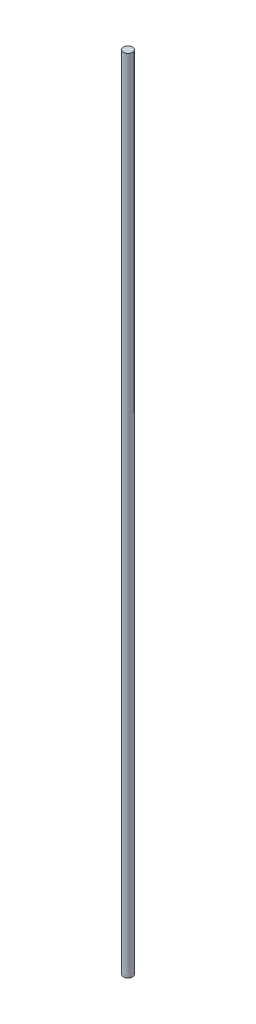
ISO-10303-21;
HEADER;
FILE_DESCRIPTION(('STEP AP214'),'2;1');
FILE_NAME('part.step','',(''),(''),'','','');
FILE_SCHEMA(('AUTOMOTIVE_DESIGN { 1 0 10303 214 1 1 1 1 }'));
ENDSEC;
DATA;
#1=APPLICATION_CONTEXT('core data for automotive mechanical design processes');
#2=APPLICATION_PROTOCOL_DEFINITION('international standard','automotive_design',2000,#1);
#3=PRODUCT_CONTEXT('',#1,'mechanical');
#4=PRODUCT('Part','Part','',(#3));
#5=PRODUCT_RELATED_PRODUCT_CATEGORY('part','',(#4));
#6=PRODUCT_DEFINITION_FORMATION('','',#4);
#7=PRODUCT_DEFINITION_CONTEXT('part definition',#1,'design');
#8=PRODUCT_DEFINITION('design','',#6,#7);
#9=PRODUCT_DEFINITION_SHAPE('','',#8);
#10=(LENGTH_UNIT() NAMED_UNIT(*) SI_UNIT(.MILLI.,.METRE.));
#11=(NAMED_UNIT(*) PLANE_ANGLE_UNIT() SI_UNIT($,.RADIAN.));
#12=(NAMED_UNIT(*) SI_UNIT($,.STERADIAN.) SOLID_ANGLE_UNIT());
#13=UNCERTAINTY_MEASURE_WITH_UNIT(LENGTH_MEASURE(1.E-05),#10,'distance_accuracy_value','');
#14=(GEOMETRIC_REPRESENTATION_CONTEXT(3) GLOBAL_UNCERTAINTY_ASSIGNED_CONTEXT((#13)) GLOBAL_UNIT_ASSIGNED_CONTEXT((#10,
#11,#12)) REPRESENTATION_CONTEXT('',''));
#15=CARTESIAN_POINT('',(0.,0.,0.));
#16=DIRECTION('',(0.,0.,1.));
#17=DIRECTION('',(1.,0.,0.));
#18=AXIS2_PLACEMENT_3D('',#15,#16,#17);
#19=CARTESIAN_POINT('',(0.,265.,0.));
#20=DIRECTION('',(0.,-1.,0.));
#21=DIRECTION('',(0.,0.,-1.));
#22=AXIS2_PLACEMENT_3D('',#19,#20,#21);
#23=CYLINDRICAL_SURFACE('',#22,1.5);
#24=CARTESIAN_POINT('',(0.,265.,0.));
#25=DIRECTION('',(0.,1.,0.));
#26=DIRECTION('',(0.,0.,1.));
#27=AXIS2_PLACEMENT_3D('',#24,#25,#26);
#28=CIRCLE('',#27,1.5);
#29=CARTESIAN_POINT('',(0.,265.,1.5));
#30=VERTEX_POINT('',#29);
#31=EDGE_CURVE('E10',#30,#30,#28,.T.);
#32=ORIENTED_EDGE('',*,*,#31,.F.);
#33=EDGE_LOOP('',(#32));
#34=FACE_BOUND('',#33,.T.);
#35=CARTESIAN_POINT('',(0.,0.,0.));
#36=DIRECTION('',(0.,1.,0.));
#37=DIRECTION('',(0.,0.,1.));
#38=AXIS2_PLACEMENT_3D('',#35,#36,#37);
#39=CIRCLE('',#38,1.5);
#40=CARTESIAN_POINT('',(0.,0.,1.5));
#41=VERTEX_POINT('',#40);
#42=EDGE_CURVE('E43',#41,#41,#39,.T.);
#43=ORIENTED_EDGE('',*,*,#42,.T.);
#44=EDGE_LOOP('',(#43));
#45=FACE_BOUND('',#44,.T.);
#46=ADVANCED_FACE('F40',(#34,#45),#23,.T.);
#47=CARTESIAN_POINT('',(0.,265.,0.));
#48=DIRECTION('',(0.,1.,0.));
#49=DIRECTION('',(0.,0.,1.));
#50=AXIS2_PLACEMENT_3D('',#47,#48,#49);
#51=PLANE('',#50);
#52=ORIENTED_EDGE('',*,*,#31,.T.);
#53=EDGE_LOOP('',(#52));
#54=FACE_BOUND('',#53,.T.);
#55=ADVANCED_FACE('F55',(#54),#51,.T.);
#56=CARTESIAN_POINT('',(0.,0.,0.));
#57=DIRECTION('',(0.,1.,0.));
#58=DIRECTION('',(0.,0.,1.));
#59=AXIS2_PLACEMENT_3D('',#56,#57,#58);
#60=PLANE('',#59);
#61=ORIENTED_EDGE('',*,*,#42,.F.);
#62=EDGE_LOOP('',(#61));
#63=FACE_BOUND('',#62,.T.);
#64=ADVANCED_FACE('F53',(#63),#60,.F.);
#65=CLOSED_SHELL('',(#46,#55,#64));
#66=MANIFOLD_SOLID_BREP('B2',#65);
#67=ADVANCED_BREP_SHAPE_REPRESENTATION('',(#18,#66),#14);
#68=SHAPE_DEFINITION_REPRESENTATION(#9,#67);
ENDSEC;
END-ISO-10303-21;
